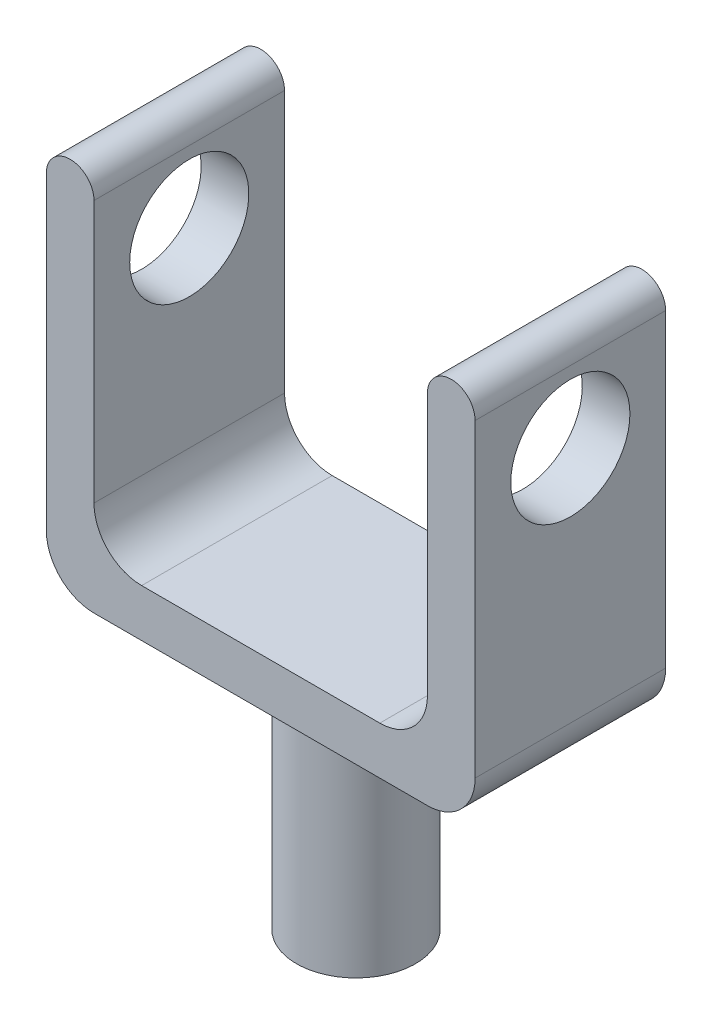
ISO-10303-21;
HEADER;
FILE_DESCRIPTION(('STEP AP214'),'2;1');
FILE_NAME('part.step','',(''),(''),'','','');
FILE_SCHEMA(('AUTOMOTIVE_DESIGN { 1 0 10303 214 1 1 1 1 }'));
ENDSEC;
DATA;
#1=APPLICATION_CONTEXT('core data for automotive mechanical design processes');
#2=APPLICATION_PROTOCOL_DEFINITION('international standard','automotive_design',2000,#1);
#3=PRODUCT_CONTEXT('',#1,'mechanical');
#4=PRODUCT('Part','Part','',(#3));
#5=PRODUCT_RELATED_PRODUCT_CATEGORY('part','',(#4));
#6=PRODUCT_DEFINITION_FORMATION('','',#4);
#7=PRODUCT_DEFINITION_CONTEXT('part definition',#1,'design');
#8=PRODUCT_DEFINITION('design','',#6,#7);
#9=PRODUCT_DEFINITION_SHAPE('','',#8);
#10=(LENGTH_UNIT() NAMED_UNIT(*) SI_UNIT(.MILLI.,.METRE.));
#11=(NAMED_UNIT(*) PLANE_ANGLE_UNIT() SI_UNIT($,.RADIAN.));
#12=(NAMED_UNIT(*) SI_UNIT($,.STERADIAN.) SOLID_ANGLE_UNIT());
#13=UNCERTAINTY_MEASURE_WITH_UNIT(LENGTH_MEASURE(1.E-05),#10,'distance_accuracy_value','');
#14=(GEOMETRIC_REPRESENTATION_CONTEXT(3) GLOBAL_UNCERTAINTY_ASSIGNED_CONTEXT((#13)) GLOBAL_UNIT_ASSIGNED_CONTEXT((#10,
#11,#12)) REPRESENTATION_CONTEXT('',''));
#15=CARTESIAN_POINT('',(0.,0.,0.));
#16=DIRECTION('',(0.,0.,1.));
#17=DIRECTION('',(1.,0.,0.));
#18=AXIS2_PLACEMENT_3D('',#15,#16,#17);
#19=CARTESIAN_POINT('',(-684.725848563968,50.,400.));
#20=DIRECTION('',(0.,-1.,0.));
#21=DIRECTION('',(0.,0.,-1.));
#22=AXIS2_PLACEMENT_3D('',#19,#20,#21);
#23=PLANE('',#22);
#24=DIRECTION('',(-1.,0.,0.));
#25=VECTOR('',#24,1.);
#26=CARTESIAN_POINT('',(-684.725848563968,50.,400.));
#27=LINE('',#26,#25);
#28=CARTESIAN_POINT('',(-84.7258485639683,50.,400.));
#29=VERTEX_POINT('',#28);
#30=CARTESIAN_POINT('',(-584.725848563968,50.,400.));
#31=VERTEX_POINT('',#30);
#32=EDGE_CURVE('E143',#29,#31,#27,.T.);
#33=ORIENTED_EDGE('',*,*,#32,.F.);
#34=DIRECTION('',(0.,0.,-1.));
#35=VECTOR('',#34,1.);
#36=CARTESIAN_POINT('',(-84.7258485639683,50.,0.));
#37=LINE('',#36,#35);
#38=CARTESIAN_POINT('',(-84.7258485639683,50.,0.));
#39=VERTEX_POINT('',#38);
#40=EDGE_CURVE('E214',#29,#39,#37,.T.);
#41=ORIENTED_EDGE('',*,*,#40,.T.);
#42=DIRECTION('',(-1.,0.,0.));
#43=VECTOR('',#42,1.);
#44=CARTESIAN_POINT('',(-684.725848563968,50.,0.));
#45=LINE('',#44,#43);
#46=CARTESIAN_POINT('',(-584.725848563968,50.,0.));
#47=VERTEX_POINT('',#46);
#48=EDGE_CURVE('E171',#39,#47,#45,.T.);
#49=ORIENTED_EDGE('',*,*,#48,.T.);
#50=DIRECTION('',(0.,0.,-1.));
#51=VECTOR('',#50,1.);
#52=CARTESIAN_POINT('',(-584.725848563968,50.,400.));
#53=LINE('',#52,#51);
#54=EDGE_CURVE('E212',#47,#31,#53,.F.);
#55=ORIENTED_EDGE('',*,*,#54,.T.);
#56=EDGE_LOOP('',(#33,#41,#49,#55));
#57=FACE_BOUND('',#56,.T.);
#58=ADVANCED_FACE('F39',(#57),#23,.F.);
#59=CARTESIAN_POINT('',(-684.725848563968,50.,400.));
#60=DIRECTION('',(-1.,0.,0.));
#61=DIRECTION('',(0.,0.,1.));
#62=AXIS2_PLACEMENT_3D('',#59,#60,#61);
#63=PLANE('',#62);
#64=CARTESIAN_POINT('',(-684.725848563968,550.,200.));
#65=DIRECTION('',(-1.,0.,0.));
#66=DIRECTION('',(0.,0.,1.));
#67=AXIS2_PLACEMENT_3D('',#64,#65,#66);
#68=CIRCLE('',#67,125.);
#69=CARTESIAN_POINT('',(-684.725848563968,550.,325.));
#70=VERTEX_POINT('',#69);
#71=EDGE_CURVE('E422',#70,#70,#68,.T.);
#72=ORIENTED_EDGE('',*,*,#71,.T.);
#73=EDGE_LOOP('',(#72));
#74=FACE_BOUND('',#73,.T.);
#75=DIRECTION('',(0.,1.,0.));
#76=VECTOR('',#75,1.);
#77=CARTESIAN_POINT('',(-684.725848563968,50.,400.));
#78=LINE('',#77,#76);
#79=CARTESIAN_POINT('',(-684.725848563968,150.,400.));
#80=VERTEX_POINT('',#79);
#81=CARTESIAN_POINT('',(-684.725848563968,700.,400.));
#82=VERTEX_POINT('',#81);
#83=EDGE_CURVE('E131',#80,#82,#78,.T.);
#84=ORIENTED_EDGE('',*,*,#83,.F.);
#85=DIRECTION('',(0.,0.,-1.));
#86=VECTOR('',#85,1.);
#87=CARTESIAN_POINT('',(-684.725848563968,150.,0.));
#88=LINE('',#87,#86);
#89=CARTESIAN_POINT('',(-684.725848563968,150.,0.));
#90=VERTEX_POINT('',#89);
#91=EDGE_CURVE('E218',#80,#90,#88,.T.);
#92=ORIENTED_EDGE('',*,*,#91,.T.);
#93=DIRECTION('',(0.,1.,0.));
#94=VECTOR('',#93,1.);
#95=CARTESIAN_POINT('',(-684.725848563968,50.,0.));
#96=LINE('',#95,#94);
#97=CARTESIAN_POINT('',(-684.725848563968,700.,0.));
#98=VERTEX_POINT('',#97);
#99=EDGE_CURVE('E149',#90,#98,#96,.T.);
#100=ORIENTED_EDGE('',*,*,#99,.T.);
#101=DIRECTION('',(0.,0.,-1.));
#102=VECTOR('',#101,1.);
#103=CARTESIAN_POINT('',(-684.725848563968,700.,400.));
#104=LINE('',#103,#102);
#105=EDGE_CURVE('E146',#82,#98,#104,.T.);
#106=ORIENTED_EDGE('',*,*,#105,.F.);
#107=EDGE_LOOP('',(#84,#92,#100,#106));
#108=FACE_BOUND('',#107,.T.);
#109=ADVANCED_FACE('F147',(#74,#108),#63,.F.);
#110=CARTESIAN_POINT('',(-734.725848563968,700.,400.));
#111=DIRECTION('',(0.,0.,-1.));
#112=DIRECTION('',(-1.,0.,0.));
#113=AXIS2_PLACEMENT_3D('',#110,#111,#112);
#114=CYLINDRICAL_SURFACE('',#113,50.);
#115=CARTESIAN_POINT('',(-734.725848563968,700.,0.));
#116=DIRECTION('',(0.,0.,1.));
#117=DIRECTION('',(1.,0.,0.));
#118=AXIS2_PLACEMENT_3D('',#115,#116,#117);
#119=CIRCLE('',#118,50.);
#120=CARTESIAN_POINT('',(-784.725848563968,700.,0.));
#121=VERTEX_POINT('',#120);
#122=EDGE_CURVE('E176',#98,#121,#119,.T.);
#123=ORIENTED_EDGE('',*,*,#122,.T.);
#124=DIRECTION('',(0.,0.,-1.));
#125=VECTOR('',#124,1.);
#126=CARTESIAN_POINT('',(-784.725848563968,700.,400.));
#127=LINE('',#126,#125);
#128=CARTESIAN_POINT('',(-784.725848563968,700.,400.));
#129=VERTEX_POINT('',#128);
#130=EDGE_CURVE('E153',#129,#121,#127,.T.);
#131=ORIENTED_EDGE('',*,*,#130,.F.);
#132=CARTESIAN_POINT('',(-734.725848563968,700.,400.));
#133=DIRECTION('',(0.,0.,1.));
#134=DIRECTION('',(1.,0.,0.));
#135=AXIS2_PLACEMENT_3D('',#132,#133,#134);
#136=CIRCLE('',#135,50.);
#137=EDGE_CURVE('E136',#82,#129,#136,.T.);
#138=ORIENTED_EDGE('',*,*,#137,.F.);
#139=ORIENTED_EDGE('',*,*,#105,.T.);
#140=EDGE_LOOP('',(#123,#131,#138,#139));
#141=FACE_BOUND('',#140,.T.);
#142=ADVANCED_FACE('F155',(#141),#114,.T.);
#143=CARTESIAN_POINT('',(-784.725848563968,-50.,400.));
#144=DIRECTION('',(1.,0.,0.));
#145=DIRECTION('',(0.,0.,-1.));
#146=AXIS2_PLACEMENT_3D('',#143,#144,#145);
#147=PLANE('',#146);
#148=CARTESIAN_POINT('',(-784.725848563968,550.,200.));
#149=DIRECTION('',(-1.,0.,0.));
#150=DIRECTION('',(0.,0.,1.));
#151=AXIS2_PLACEMENT_3D('',#148,#149,#150);
#152=CIRCLE('',#151,125.);
#153=CARTESIAN_POINT('',(-784.725848563968,550.,325.));
#154=VERTEX_POINT('',#153);
#155=EDGE_CURVE('E419',#154,#154,#152,.T.);
#156=ORIENTED_EDGE('',*,*,#155,.F.);
#157=EDGE_LOOP('',(#156));
#158=FACE_BOUND('',#157,.T.);
#159=DIRECTION('',(0.,-1.,0.));
#160=VECTOR('',#159,1.);
#161=CARTESIAN_POINT('',(-784.725848563968,-50.,0.));
#162=LINE('',#161,#160);
#163=CARTESIAN_POINT('',(-784.725848563968,50.,0.));
#164=VERTEX_POINT('',#163);
#165=EDGE_CURVE('E178',#121,#164,#162,.T.);
#166=ORIENTED_EDGE('',*,*,#165,.T.);
#167=DIRECTION('',(0.,0.,-1.));
#168=VECTOR('',#167,1.);
#169=CARTESIAN_POINT('',(-784.725848563968,50.,400.));
#170=LINE('',#169,#168);
#171=CARTESIAN_POINT('',(-784.725848563968,50.,400.));
#172=VERTEX_POINT('',#171);
#173=EDGE_CURVE('E63',#164,#172,#170,.F.);
#174=ORIENTED_EDGE('',*,*,#173,.T.);
#175=DIRECTION('',(0.,-1.,0.));
#176=VECTOR('',#175,1.);
#177=CARTESIAN_POINT('',(-784.725848563968,-50.,400.));
#178=LINE('',#177,#176);
#179=EDGE_CURVE('E157',#129,#172,#178,.T.);
#180=ORIENTED_EDGE('',*,*,#179,.F.);
#181=ORIENTED_EDGE('',*,*,#130,.T.);
#182=EDGE_LOOP('',(#166,#174,#180,#181));
#183=FACE_BOUND('',#182,.T.);
#184=ADVANCED_FACE('F301',(#158,#183),#147,.F.);
#185=CARTESIAN_POINT('',(-784.725848563968,-50.,400.));
#186=DIRECTION('',(0.,1.,0.));
#187=DIRECTION('',(0.,0.,1.));
#188=AXIS2_PLACEMENT_3D('',#185,#186,#187);
#189=PLANE('',#188);
#190=CARTESIAN_POINT('',(-334.725848563968,-50.,200.));
#191=DIRECTION('',(0.,-1.,0.));
#192=DIRECTION('',(0.,0.,-1.));
#193=AXIS2_PLACEMENT_3D('',#190,#191,#192);
#194=CIRCLE('',#193,125.);
#195=CARTESIAN_POINT('',(-334.725848563968,-50.,75.));
#196=VERTEX_POINT('',#195);
#197=EDGE_CURVE('E152',#196,#196,#194,.T.);
#198=ORIENTED_EDGE('',*,*,#197,.F.);
#199=EDGE_LOOP('',(#198));
#200=FACE_BOUND('',#199,.T.);
#201=DIRECTION('',(1.,0.,0.));
#202=VECTOR('',#201,1.);
#203=CARTESIAN_POINT('',(-784.725848563968,-50.,0.));
#204=LINE('',#203,#202);
#205=CARTESIAN_POINT('',(-684.725848563968,-50.,0.));
#206=VERTEX_POINT('',#205);
#207=CARTESIAN_POINT('',(15.2741514360318,-50.,0.));
#208=VERTEX_POINT('',#207);
#209=EDGE_CURVE('E180',#206,#208,#204,.T.);
#210=ORIENTED_EDGE('',*,*,#209,.T.);
#211=DIRECTION('',(0.,0.,-1.));
#212=VECTOR('',#211,1.);
#213=CARTESIAN_POINT('',(15.2741514360318,-50.,400.));
#214=LINE('',#213,#212);
#215=CARTESIAN_POINT('',(15.2741514360318,-50.,400.));
#216=VERTEX_POINT('',#215);
#217=EDGE_CURVE('E205',#208,#216,#214,.F.);
#218=ORIENTED_EDGE('',*,*,#217,.T.);
#219=DIRECTION('',(1.,0.,0.));
#220=VECTOR('',#219,1.);
#221=CARTESIAN_POINT('',(-784.725848563968,-50.,400.));
#222=LINE('',#221,#220);
#223=CARTESIAN_POINT('',(-684.725848563968,-50.,400.));
#224=VERTEX_POINT('',#223);
#225=EDGE_CURVE('E159',#224,#216,#222,.T.);
#226=ORIENTED_EDGE('',*,*,#225,.F.);
#227=DIRECTION('',(0.,0.,-1.));
#228=VECTOR('',#227,1.);
#229=CARTESIAN_POINT('',(-684.725848563968,-50.,400.));
#230=LINE('',#229,#228);
#231=EDGE_CURVE('E202',#224,#206,#230,.T.);
#232=ORIENTED_EDGE('',*,*,#231,.T.);
#233=EDGE_LOOP('',(#210,#218,#226,#232));
#234=FACE_BOUND('',#233,.T.);
#235=ADVANCED_FACE('F268',(#200,#234),#189,.F.);
#236=CARTESIAN_POINT('',(115.274151436032,-50.,400.));
#237=DIRECTION('',(-1.,0.,0.));
#238=DIRECTION('',(0.,-1.,0.));
#239=AXIS2_PLACEMENT_3D('',#236,#237,#238);
#240=PLANE('',#239);
#241=CARTESIAN_POINT('',(115.274151436032,550.,200.));
#242=DIRECTION('',(-1.,0.,0.));
#243=DIRECTION('',(0.,-1.,0.));
#244=AXIS2_PLACEMENT_3D('',#241,#242,#243);
#245=CIRCLE('',#244,125.);
#246=CARTESIAN_POINT('',(115.274151436032,425.,200.));
#247=VERTEX_POINT('',#246);
#248=EDGE_CURVE('E423',#247,#247,#245,.T.);
#249=ORIENTED_EDGE('',*,*,#248,.T.);
#250=EDGE_LOOP('',(#249));
#251=FACE_BOUND('',#250,.T.);
#252=DIRECTION('',(0.,1.,0.));
#253=VECTOR('',#252,1.);
#254=CARTESIAN_POINT('',(115.274151436032,-50.,400.));
#255=LINE('',#254,#253);
#256=CARTESIAN_POINT('',(115.274151436032,50.,400.));
#257=VERTEX_POINT('',#256);
#258=CARTESIAN_POINT('',(115.274151436032,700.,400.));
#259=VERTEX_POINT('',#258);
#260=EDGE_CURVE('E164',#257,#259,#255,.T.);
#261=ORIENTED_EDGE('',*,*,#260,.F.);
#262=DIRECTION('',(0.,0.,-1.));
#263=VECTOR('',#262,1.);
#264=CARTESIAN_POINT('',(115.274151436032,50.,400.));
#265=LINE('',#264,#263);
#266=CARTESIAN_POINT('',(115.274151436032,50.,0.));
#267=VERTEX_POINT('',#266);
#268=EDGE_CURVE('E195',#257,#267,#265,.T.);
#269=ORIENTED_EDGE('',*,*,#268,.T.);
#270=DIRECTION('',(0.,1.,0.));
#271=VECTOR('',#270,1.);
#272=CARTESIAN_POINT('',(115.274151436032,-50.,0.));
#273=LINE('',#272,#271);
#274=CARTESIAN_POINT('',(115.274151436032,700.,0.));
#275=VERTEX_POINT('',#274);
#276=EDGE_CURVE('E183',#267,#275,#273,.T.);
#277=ORIENTED_EDGE('',*,*,#276,.T.);
#278=DIRECTION('',(0.,0.,-1.));
#279=VECTOR('',#278,1.);
#280=CARTESIAN_POINT('',(115.274151436032,700.,400.));
#281=LINE('',#280,#279);
#282=EDGE_CURVE('E191',#259,#275,#281,.T.);
#283=ORIENTED_EDGE('',*,*,#282,.F.);
#284=EDGE_LOOP('',(#261,#269,#277,#283));
#285=FACE_BOUND('',#284,.T.);
#286=ADVANCED_FACE('F275',(#251,#285),#240,.F.);
#287=CARTESIAN_POINT('',(65.2741514360318,700.,400.));
#288=DIRECTION('',(0.,0.,-1.));
#289=DIRECTION('',(-1.,0.,0.));
#290=AXIS2_PLACEMENT_3D('',#287,#288,#289);
#291=CYLINDRICAL_SURFACE('',#290,50.);
#292=CARTESIAN_POINT('',(65.2741514360318,700.,0.));
#293=DIRECTION('',(0.,0.,1.));
#294=DIRECTION('',(-1.,0.,0.));
#295=AXIS2_PLACEMENT_3D('',#292,#293,#294);
#296=CIRCLE('',#295,50.);
#297=CARTESIAN_POINT('',(15.2741514360318,700.,0.));
#298=VERTEX_POINT('',#297);
#299=EDGE_CURVE('E185',#275,#298,#296,.T.);
#300=ORIENTED_EDGE('',*,*,#299,.T.);
#301=DIRECTION('',(0.,0.,-1.));
#302=VECTOR('',#301,1.);
#303=CARTESIAN_POINT('',(15.2741514360318,700.,400.));
#304=LINE('',#303,#302);
#305=CARTESIAN_POINT('',(15.2741514360318,700.,400.));
#306=VERTEX_POINT('',#305);
#307=EDGE_CURVE('E170',#306,#298,#304,.T.);
#308=ORIENTED_EDGE('',*,*,#307,.F.);
#309=CARTESIAN_POINT('',(65.2741514360318,700.,400.));
#310=DIRECTION('',(0.,0.,1.));
#311=DIRECTION('',(-1.,0.,0.));
#312=AXIS2_PLACEMENT_3D('',#309,#310,#311);
#313=CIRCLE('',#312,50.);
#314=EDGE_CURVE('E166',#259,#306,#313,.T.);
#315=ORIENTED_EDGE('',*,*,#314,.F.);
#316=ORIENTED_EDGE('',*,*,#282,.T.);
#317=EDGE_LOOP('',(#300,#308,#315,#316));
#318=FACE_BOUND('',#317,.T.);
#319=ADVANCED_FACE('F280',(#318),#291,.T.);
#320=CARTESIAN_POINT('',(15.2741514360317,50.,400.));
#321=DIRECTION('',(1.,0.,0.));
#322=DIRECTION('',(0.,1.,0.));
#323=AXIS2_PLACEMENT_3D('',#320,#321,#322);
#324=PLANE('',#323);
#325=CARTESIAN_POINT('',(15.2741514360317,550.,200.));
#326=DIRECTION('',(1.,0.,0.));
#327=DIRECTION('',(0.,1.,0.));
#328=AXIS2_PLACEMENT_3D('',#325,#326,#327);
#329=CIRCLE('',#328,125.);
#330=CARTESIAN_POINT('',(15.2741514360317,675.,200.));
#331=VERTEX_POINT('',#330);
#332=EDGE_CURVE('E43',#331,#331,#329,.T.);
#333=ORIENTED_EDGE('',*,*,#332,.T.);
#334=EDGE_LOOP('',(#333));
#335=FACE_BOUND('',#334,.T.);
#336=DIRECTION('',(0.,-1.,0.));
#337=VECTOR('',#336,1.);
#338=CARTESIAN_POINT('',(15.2741514360317,50.,0.));
#339=LINE('',#338,#337);
#340=CARTESIAN_POINT('',(15.2741514360317,150.,0.));
#341=VERTEX_POINT('',#340);
#342=EDGE_CURVE('E187',#298,#341,#339,.T.);
#343=ORIENTED_EDGE('',*,*,#342,.T.);
#344=DIRECTION('',(0.,0.,-1.));
#345=VECTOR('',#344,1.);
#346=CARTESIAN_POINT('',(15.2741514360317,150.,400.));
#347=LINE('',#346,#345);
#348=CARTESIAN_POINT('',(15.2741514360317,150.,400.));
#349=VERTEX_POINT('',#348);
#350=EDGE_CURVE('E55',#341,#349,#347,.F.);
#351=ORIENTED_EDGE('',*,*,#350,.T.);
#352=DIRECTION('',(0.,-1.,0.));
#353=VECTOR('',#352,1.);
#354=CARTESIAN_POINT('',(15.2741514360317,50.,400.));
#355=LINE('',#354,#353);
#356=EDGE_CURVE('E168',#306,#349,#355,.T.);
#357=ORIENTED_EDGE('',*,*,#356,.F.);
#358=ORIENTED_EDGE('',*,*,#307,.T.);
#359=EDGE_LOOP('',(#343,#351,#357,#358));
#360=FACE_BOUND('',#359,.T.);
#361=ADVANCED_FACE('F283',(#335,#360),#324,.F.);
#362=CARTESIAN_POINT('',(65.2741514360318,700.,400.));
#363=DIRECTION('',(0.,0.,-1.));
#364=DIRECTION('',(-1.,0.,0.));
#365=AXIS2_PLACEMENT_3D('',#362,#363,#364);
#366=PLANE('',#365);
#367=ORIENTED_EDGE('',*,*,#225,.T.);
#368=CARTESIAN_POINT('',(15.2741514360318,50.,400.));
#369=DIRECTION('',(0.,0.,-1.));
#370=DIRECTION('',(-1.,0.,0.));
#371=AXIS2_PLACEMENT_3D('',#368,#369,#370);
#372=CIRCLE('',#371,100.);
#373=EDGE_CURVE('E209',#216,#257,#372,.F.);
#374=ORIENTED_EDGE('',*,*,#373,.T.);
#375=ORIENTED_EDGE('',*,*,#260,.T.);
#376=ORIENTED_EDGE('',*,*,#314,.T.);
#377=ORIENTED_EDGE('',*,*,#356,.T.);
#378=CARTESIAN_POINT('',(-84.7258485639683,150.,400.));
#379=DIRECTION('',(0.,0.,-1.));
#380=DIRECTION('',(-1.,0.,0.));
#381=AXIS2_PLACEMENT_3D('',#378,#379,#380);
#382=CIRCLE('',#381,100.);
#383=EDGE_CURVE('E222',#349,#29,#382,.T.);
#384=ORIENTED_EDGE('',*,*,#383,.T.);
#385=ORIENTED_EDGE('',*,*,#32,.T.);
#386=CARTESIAN_POINT('',(-584.725848563968,150.,400.));
#387=DIRECTION('',(0.,0.,-1.));
#388=DIRECTION('',(-1.,0.,0.));
#389=AXIS2_PLACEMENT_3D('',#386,#387,#388);
#390=CIRCLE('',#389,100.);
#391=EDGE_CURVE('E11',#31,#80,#390,.T.);
#392=ORIENTED_EDGE('',*,*,#391,.T.);
#393=ORIENTED_EDGE('',*,*,#83,.T.);
#394=ORIENTED_EDGE('',*,*,#137,.T.);
#395=ORIENTED_EDGE('',*,*,#179,.T.);
#396=CARTESIAN_POINT('',(-684.725848563968,50.,400.));
#397=DIRECTION('',(0.,0.,-1.));
#398=DIRECTION('',(-1.,0.,0.));
#399=AXIS2_PLACEMENT_3D('',#396,#397,#398);
#400=CIRCLE('',#399,100.);
#401=EDGE_CURVE('E207',#172,#224,#400,.F.);
#402=ORIENTED_EDGE('',*,*,#401,.T.);
#403=EDGE_LOOP('',(#367,#374,#375,#376,#377,#384,#385,#392,#393,#394,#395,#402));
#404=FACE_BOUND('',#403,.T.);
#405=ADVANCED_FACE('F134',(#404),#366,.F.);
#406=CARTESIAN_POINT('',(65.2741514360318,700.,0.));
#407=DIRECTION('',(0.,0.,-1.));
#408=DIRECTION('',(-1.,0.,0.));
#409=AXIS2_PLACEMENT_3D('',#406,#407,#408);
#410=PLANE('',#409);
#411=ORIENTED_EDGE('',*,*,#276,.F.);
#412=CARTESIAN_POINT('',(15.2741514360318,50.,0.));
#413=DIRECTION('',(0.,0.,-1.));
#414=DIRECTION('',(-1.,0.,0.));
#415=AXIS2_PLACEMENT_3D('',#412,#413,#414);
#416=CIRCLE('',#415,100.);
#417=EDGE_CURVE('E200',#267,#208,#416,.T.);
#418=ORIENTED_EDGE('',*,*,#417,.T.);
#419=ORIENTED_EDGE('',*,*,#209,.F.);
#420=CARTESIAN_POINT('',(-684.725848563968,50.,0.));
#421=DIRECTION('',(0.,0.,-1.));
#422=DIRECTION('',(-1.,0.,0.));
#423=AXIS2_PLACEMENT_3D('',#420,#421,#422);
#424=CIRCLE('',#423,100.);
#425=EDGE_CURVE('E198',#206,#164,#424,.T.);
#426=ORIENTED_EDGE('',*,*,#425,.T.);
#427=ORIENTED_EDGE('',*,*,#165,.F.);
#428=ORIENTED_EDGE('',*,*,#122,.F.);
#429=ORIENTED_EDGE('',*,*,#99,.F.);
#430=CARTESIAN_POINT('',(-584.725848563968,150.,0.));
#431=DIRECTION('',(0.,0.,-1.));
#432=DIRECTION('',(-1.,0.,0.));
#433=AXIS2_PLACEMENT_3D('',#430,#431,#432);
#434=CIRCLE('',#433,100.);
#435=EDGE_CURVE('E48',#90,#47,#434,.F.);
#436=ORIENTED_EDGE('',*,*,#435,.T.);
#437=ORIENTED_EDGE('',*,*,#48,.F.);
#438=CARTESIAN_POINT('',(-84.7258485639683,150.,0.));
#439=DIRECTION('',(0.,0.,-1.));
#440=DIRECTION('',(-1.,0.,0.));
#441=AXIS2_PLACEMENT_3D('',#438,#439,#440);
#442=CIRCLE('',#441,100.);
#443=EDGE_CURVE('E220',#39,#341,#442,.F.);
#444=ORIENTED_EDGE('',*,*,#443,.T.);
#445=ORIENTED_EDGE('',*,*,#342,.F.);
#446=ORIENTED_EDGE('',*,*,#299,.F.);
#447=EDGE_LOOP('',(#411,#418,#419,#426,#427,#428,#429,#436,#437,#444,#445,#446));
#448=FACE_BOUND('',#447,.T.);
#449=ADVANCED_FACE('F227',(#448),#410,.T.);
#450=CARTESIAN_POINT('',(-334.725848563968,-550.,200.));
#451=DIRECTION('',(0.,1.,0.));
#452=DIRECTION('',(0.,0.,1.));
#453=AXIS2_PLACEMENT_3D('',#450,#451,#452);
#454=CYLINDRICAL_SURFACE('',#453,125.);
#455=CARTESIAN_POINT('',(-334.725848563968,-550.,200.));
#456=DIRECTION('',(0.,-1.,0.));
#457=DIRECTION('',(0.,0.,-1.));
#458=AXIS2_PLACEMENT_3D('',#455,#456,#457);
#459=CIRCLE('',#458,125.);
#460=CARTESIAN_POINT('',(-334.725848563968,-550.,75.));
#461=VERTEX_POINT('',#460);
#462=EDGE_CURVE('E174',#461,#461,#459,.T.);
#463=ORIENTED_EDGE('',*,*,#462,.F.);
#464=EDGE_LOOP('',(#463));
#465=FACE_BOUND('',#464,.T.);
#466=ORIENTED_EDGE('',*,*,#197,.T.);
#467=EDGE_LOOP('',(#466));
#468=FACE_BOUND('',#467,.T.);
#469=ADVANCED_FACE('F333',(#465,#468),#454,.T.);
#470=CARTESIAN_POINT('',(-334.725848563968,-550.,200.));
#471=DIRECTION('',(0.,-1.,0.));
#472=DIRECTION('',(0.,0.,-1.));
#473=AXIS2_PLACEMENT_3D('',#470,#471,#472);
#474=PLANE('',#473);
#475=ORIENTED_EDGE('',*,*,#462,.T.);
#476=EDGE_LOOP('',(#475));
#477=FACE_BOUND('',#476,.T.);
#478=ADVANCED_FACE('F257',(#477),#474,.T.);
#479=CARTESIAN_POINT('',(15.2741514360318,50.,400.));
#480=DIRECTION('',(0.,0.,-1.));
#481=DIRECTION('',(-1.,0.,0.));
#482=AXIS2_PLACEMENT_3D('',#479,#480,#481);
#483=CYLINDRICAL_SURFACE('',#482,100.);
#484=ORIENTED_EDGE('',*,*,#373,.F.);
#485=ORIENTED_EDGE('',*,*,#217,.F.);
#486=ORIENTED_EDGE('',*,*,#417,.F.);
#487=ORIENTED_EDGE('',*,*,#268,.F.);
#488=EDGE_LOOP('',(#484,#485,#486,#487));
#489=FACE_BOUND('',#488,.T.);
#490=ADVANCED_FACE('F254',(#489),#483,.T.);
#491=CARTESIAN_POINT('',(-684.725848563968,50.,400.));
#492=DIRECTION('',(0.,0.,-1.));
#493=DIRECTION('',(-1.,0.,0.));
#494=AXIS2_PLACEMENT_3D('',#491,#492,#493);
#495=CYLINDRICAL_SURFACE('',#494,100.);
#496=ORIENTED_EDGE('',*,*,#401,.F.);
#497=ORIENTED_EDGE('',*,*,#173,.F.);
#498=ORIENTED_EDGE('',*,*,#425,.F.);
#499=ORIENTED_EDGE('',*,*,#231,.F.);
#500=EDGE_LOOP('',(#496,#497,#498,#499));
#501=FACE_BOUND('',#500,.T.);
#502=ADVANCED_FACE('F243',(#501),#495,.T.);
#503=CARTESIAN_POINT('',(-84.7258485639683,150.,400.));
#504=DIRECTION('',(0.,0.,1.));
#505=DIRECTION('',(1.,0.,0.));
#506=AXIS2_PLACEMENT_3D('',#503,#504,#505);
#507=CYLINDRICAL_SURFACE('',#506,100.);
#508=ORIENTED_EDGE('',*,*,#383,.F.);
#509=ORIENTED_EDGE('',*,*,#350,.F.);
#510=ORIENTED_EDGE('',*,*,#443,.F.);
#511=ORIENTED_EDGE('',*,*,#40,.F.);
#512=EDGE_LOOP('',(#508,#509,#510,#511));
#513=FACE_BOUND('',#512,.T.);
#514=ADVANCED_FACE('F235',(#513),#507,.F.);
#515=CARTESIAN_POINT('',(-584.725848563968,150.,400.));
#516=DIRECTION('',(0.,0.,1.));
#517=DIRECTION('',(1.,0.,0.));
#518=AXIS2_PLACEMENT_3D('',#515,#516,#517);
#519=CYLINDRICAL_SURFACE('',#518,100.);
#520=ORIENTED_EDGE('',*,*,#391,.F.);
#521=ORIENTED_EDGE('',*,*,#54,.F.);
#522=ORIENTED_EDGE('',*,*,#435,.F.);
#523=ORIENTED_EDGE('',*,*,#91,.F.);
#524=EDGE_LOOP('',(#520,#521,#522,#523));
#525=FACE_BOUND('',#524,.T.);
#526=ADVANCED_FACE('F41',(#525),#519,.F.);
#527=CARTESIAN_POINT('',(1261.27415143603,550.,200.));
#528=DIRECTION('',(-1.,0.,0.));
#529=DIRECTION('',(0.,0.,1.));
#530=AXIS2_PLACEMENT_3D('',#527,#528,#529);
#531=CYLINDRICAL_SURFACE('',#530,125.);
#532=ORIENTED_EDGE('',*,*,#332,.F.);
#533=EDGE_LOOP('',(#532));
#534=FACE_BOUND('',#533,.T.);
#535=ORIENTED_EDGE('',*,*,#248,.F.);
#536=EDGE_LOOP('',(#535));
#537=FACE_BOUND('',#536,.T.);
#538=ADVANCED_FACE('F234',(#534,#537),#531,.F.);
#539=ORIENTED_EDGE('',*,*,#155,.T.);
#540=EDGE_LOOP('',(#539));
#541=FACE_BOUND('',#540,.T.);
#542=ORIENTED_EDGE('',*,*,#71,.F.);
#543=EDGE_LOOP('',(#542));
#544=FACE_BOUND('',#543,.T.);
#545=ADVANCED_FACE('F240',(#541,#544),#531,.F.);
#546=CLOSED_SHELL('',(#58,#109,#142,#184,#235,#286,#319,#361,#405,#449,#469,#478,#490,#502,#514,
#526,#538,#545));
#547=MANIFOLD_SOLID_BREP('B2',#546);
#548=ADVANCED_BREP_SHAPE_REPRESENTATION('',(#18,#547),#14);
#549=SHAPE_DEFINITION_REPRESENTATION(#9,#548);
ENDSEC;
END-ISO-10303-21;
